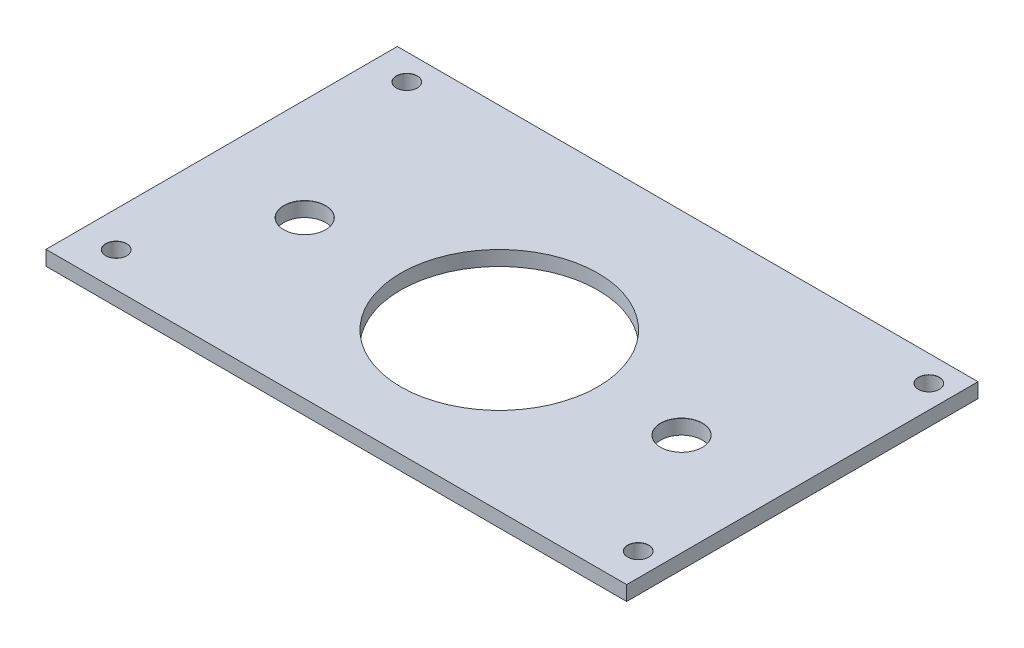
ISO-10303-21;
HEADER;
FILE_DESCRIPTION(('STEP AP214'),'2;1');
FILE_NAME('part.step','',(''),(''),'','','');
FILE_SCHEMA(('AUTOMOTIVE_DESIGN { 1 0 10303 214 1 1 1 1 }'));
ENDSEC;
DATA;
#1=APPLICATION_CONTEXT('core data for automotive mechanical design processes');
#2=APPLICATION_PROTOCOL_DEFINITION('international standard','automotive_design',2000,#1);
#3=PRODUCT_CONTEXT('',#1,'mechanical');
#4=PRODUCT('Part','Part','',(#3));
#5=PRODUCT_RELATED_PRODUCT_CATEGORY('part','',(#4));
#6=PRODUCT_DEFINITION_FORMATION('','',#4);
#7=PRODUCT_DEFINITION_CONTEXT('part definition',#1,'design');
#8=PRODUCT_DEFINITION('design','',#6,#7);
#9=PRODUCT_DEFINITION_SHAPE('','',#8);
#10=(LENGTH_UNIT() NAMED_UNIT(*) SI_UNIT(.MILLI.,.METRE.));
#11=(NAMED_UNIT(*) PLANE_ANGLE_UNIT() SI_UNIT($,.RADIAN.));
#12=(NAMED_UNIT(*) SI_UNIT($,.STERADIAN.) SOLID_ANGLE_UNIT());
#13=UNCERTAINTY_MEASURE_WITH_UNIT(LENGTH_MEASURE(1.E-05),#10,'distance_accuracy_value','');
#14=(GEOMETRIC_REPRESENTATION_CONTEXT(3) GLOBAL_UNCERTAINTY_ASSIGNED_CONTEXT((#13)) GLOBAL_UNIT_ASSIGNED_CONTEXT((#10,
#11,#12)) REPRESENTATION_CONTEXT('',''));
#15=CARTESIAN_POINT('',(0.,0.,0.));
#16=DIRECTION('',(0.,0.,1.));
#17=DIRECTION('',(1.,0.,0.));
#18=AXIS2_PLACEMENT_3D('',#15,#16,#17);
#19=CARTESIAN_POINT('',(0.,3.175,0.));
#20=DIRECTION('',(0.,-1.,0.));
#21=DIRECTION('',(0.,0.,-1.));
#22=AXIS2_PLACEMENT_3D('',#19,#20,#21);
#23=PLANE('',#22);
#24=CARTESIAN_POINT('',(-56.35,3.175,-36.38795554));
#25=DIRECTION('',(0.,1.,0.));
#26=DIRECTION('',(0.,0.,1.));
#27=AXIS2_PLACEMENT_3D('',#24,#25,#26);
#28=CIRCLE('',#27,2.275);
#29=CARTESIAN_POINT('',(-56.35,3.175,-34.11295554));
#30=VERTEX_POINT('',#29);
#31=EDGE_CURVE('E172',#30,#30,#28,.T.);
#32=ORIENTED_EDGE('',*,*,#31,.F.);
#33=EDGE_LOOP('',(#32));
#34=FACE_BOUND('',#33,.T.);
#35=CARTESIAN_POINT('',(-56.35,3.175,26.35));
#36=DIRECTION('',(0.,1.,0.));
#37=DIRECTION('',(0.,0.,1.));
#38=AXIS2_PLACEMENT_3D('',#35,#36,#37);
#39=CIRCLE('',#38,2.275);
#40=CARTESIAN_POINT('',(-56.35,3.175,28.625));
#41=VERTEX_POINT('',#40);
#42=EDGE_CURVE('E163',#41,#41,#39,.T.);
#43=ORIENTED_EDGE('',*,*,#42,.F.);
#44=EDGE_LOOP('',(#43));
#45=FACE_BOUND('',#44,.T.);
#46=CARTESIAN_POINT('',(56.35,3.175,26.35));
#47=DIRECTION('',(0.,1.,0.));
#48=DIRECTION('',(0.,0.,1.));
#49=AXIS2_PLACEMENT_3D('',#46,#47,#48);
#50=CIRCLE('',#49,2.275);
#51=CARTESIAN_POINT('',(56.35,3.175,28.625));
#52=VERTEX_POINT('',#51);
#53=EDGE_CURVE('E154',#52,#52,#50,.T.);
#54=ORIENTED_EDGE('',*,*,#53,.F.);
#55=EDGE_LOOP('',(#54));
#56=FACE_BOUND('',#55,.T.);
#57=CARTESIAN_POINT('',(56.35,3.175,-36.38795554));
#58=DIRECTION('',(0.,1.,0.));
#59=DIRECTION('',(0.,0.,1.));
#60=AXIS2_PLACEMENT_3D('',#57,#58,#59);
#61=CIRCLE('',#60,2.275);
#62=CARTESIAN_POINT('',(56.35,3.175,-34.11295554));
#63=VERTEX_POINT('',#62);
#64=EDGE_CURVE('E145',#63,#63,#61,.T.);
#65=ORIENTED_EDGE('',*,*,#64,.F.);
#66=EDGE_LOOP('',(#65));
#67=FACE_BOUND('',#66,.T.);
#68=CARTESIAN_POINT('',(-42.,3.175,0.));
#69=DIRECTION('',(0.,1.,0.));
#70=DIRECTION('',(0.,0.,1.));
#71=AXIS2_PLACEMENT_3D('',#68,#69,#70);
#72=CIRCLE('',#71,4.525);
#73=CARTESIAN_POINT('',(-42.,3.175,4.525));
#74=VERTEX_POINT('',#73);
#75=EDGE_CURVE('E105',#74,#74,#72,.T.);
#76=ORIENTED_EDGE('',*,*,#75,.F.);
#77=EDGE_LOOP('',(#76));
#78=FACE_BOUND('',#77,.T.);
#79=CARTESIAN_POINT('',(39.35,3.175,0.));
#80=DIRECTION('',(0.,1.,0.));
#81=DIRECTION('',(0.,0.,1.));
#82=AXIS2_PLACEMENT_3D('',#79,#80,#81);
#83=CIRCLE('',#82,4.525);
#84=CARTESIAN_POINT('',(39.35,3.175,4.525));
#85=VERTEX_POINT('',#84);
#86=EDGE_CURVE('E116',#85,#85,#83,.T.);
#87=ORIENTED_EDGE('',*,*,#86,.F.);
#88=EDGE_LOOP('',(#87));
#89=FACE_BOUND('',#88,.T.);
#90=DIRECTION('',(0.,0.,-1.));
#91=VECTOR('',#90,1.);
#92=CARTESIAN_POINT('',(61.35,3.175,0.));
#93=LINE('',#92,#91);
#94=CARTESIAN_POINT('',(61.35,3.175,33.85));
#95=VERTEX_POINT('',#94);
#96=CARTESIAN_POINT('',(61.35,3.175,-42.));
#97=VERTEX_POINT('',#96);
#98=EDGE_CURVE('E11',#95,#97,#93,.T.);
#99=ORIENTED_EDGE('',*,*,#98,.T.);
#100=DIRECTION('',(-1.,0.,0.));
#101=VECTOR('',#100,1.);
#102=CARTESIAN_POINT('',(-64.,3.175,-42.));
#103=LINE('',#102,#101);
#104=CARTESIAN_POINT('',(-64.,3.175,-42.));
#105=VERTEX_POINT('',#104);
#106=EDGE_CURVE('E96',#97,#105,#103,.T.);
#107=ORIENTED_EDGE('',*,*,#106,.T.);
#108=DIRECTION('',(0.,0.,1.));
#109=VECTOR('',#108,1.);
#110=CARTESIAN_POINT('',(-64.,3.175,0.));
#111=LINE('',#110,#109);
#112=CARTESIAN_POINT('',(-64.,3.175,33.85));
#113=VERTEX_POINT('',#112);
#114=EDGE_CURVE('E47',#105,#113,#111,.T.);
#115=ORIENTED_EDGE('',*,*,#114,.T.);
#116=DIRECTION('',(1.,0.,0.));
#117=VECTOR('',#116,1.);
#118=CARTESIAN_POINT('',(-64.,3.175,33.85));
#119=LINE('',#118,#117);
#120=EDGE_CURVE('E93',#113,#95,#119,.T.);
#121=ORIENTED_EDGE('',*,*,#120,.T.);
#122=EDGE_LOOP('',(#99,#107,#115,#121));
#123=FACE_BOUND('',#122,.T.);
#124=CARTESIAN_POINT('',(0.,3.175,0.));
#125=DIRECTION('',(0.,1.,0.));
#126=DIRECTION('',(0.,0.,1.));
#127=AXIS2_PLACEMENT_3D('',#124,#125,#126);
#128=CIRCLE('',#127,21.275);
#129=CARTESIAN_POINT('',(0.,3.175,21.275));
#130=VERTEX_POINT('',#129);
#131=EDGE_CURVE('E85',#130,#130,#128,.T.);
#132=ORIENTED_EDGE('',*,*,#131,.F.);
#133=EDGE_LOOP('',(#132));
#134=FACE_BOUND('',#133,.T.);
#135=ADVANCED_FACE('F37',(#34,#45,#56,#67,#78,#89,#123,#134),#23,.F.);
#136=CARTESIAN_POINT('',(0.,0.,0.));
#137=DIRECTION('',(0.,-1.,0.));
#138=DIRECTION('',(0.,0.,-1.));
#139=AXIS2_PLACEMENT_3D('',#136,#137,#138);
#140=PLANE('',#139);
#141=CARTESIAN_POINT('',(-56.35,0.,-36.38795554));
#142=DIRECTION('',(0.,1.,0.));
#143=DIRECTION('',(0.,0.,1.));
#144=AXIS2_PLACEMENT_3D('',#141,#142,#143);
#145=CIRCLE('',#144,2.25);
#146=CARTESIAN_POINT('',(-56.35,0.,-34.13795554));
#147=VERTEX_POINT('',#146);
#148=EDGE_CURVE('E166',#147,#147,#145,.T.);
#149=ORIENTED_EDGE('',*,*,#148,.T.);
#150=EDGE_LOOP('',(#149));
#151=FACE_BOUND('',#150,.T.);
#152=CARTESIAN_POINT('',(-56.35,0.,26.35));
#153=DIRECTION('',(0.,1.,0.));
#154=DIRECTION('',(0.,0.,1.));
#155=AXIS2_PLACEMENT_3D('',#152,#153,#154);
#156=CIRCLE('',#155,2.25);
#157=CARTESIAN_POINT('',(-56.35,0.,28.6));
#158=VERTEX_POINT('',#157);
#159=EDGE_CURVE('E157',#158,#158,#156,.T.);
#160=ORIENTED_EDGE('',*,*,#159,.T.);
#161=EDGE_LOOP('',(#160));
#162=FACE_BOUND('',#161,.T.);
#163=CARTESIAN_POINT('',(56.35,0.,26.35));
#164=DIRECTION('',(0.,1.,0.));
#165=DIRECTION('',(0.,0.,1.));
#166=AXIS2_PLACEMENT_3D('',#163,#164,#165);
#167=CIRCLE('',#166,2.25);
#168=CARTESIAN_POINT('',(56.35,0.,28.6));
#169=VERTEX_POINT('',#168);
#170=EDGE_CURVE('E148',#169,#169,#167,.T.);
#171=ORIENTED_EDGE('',*,*,#170,.T.);
#172=EDGE_LOOP('',(#171));
#173=FACE_BOUND('',#172,.T.);
#174=CARTESIAN_POINT('',(56.35,0.,-36.38795554));
#175=DIRECTION('',(0.,1.,0.));
#176=DIRECTION('',(0.,0.,1.));
#177=AXIS2_PLACEMENT_3D('',#174,#175,#176);
#178=CIRCLE('',#177,2.25);
#179=CARTESIAN_POINT('',(56.35,0.,-34.13795554));
#180=VERTEX_POINT('',#179);
#181=EDGE_CURVE('E137',#180,#180,#178,.T.);
#182=ORIENTED_EDGE('',*,*,#181,.T.);
#183=EDGE_LOOP('',(#182));
#184=FACE_BOUND('',#183,.T.);
#185=CARTESIAN_POINT('',(-42.,0.,0.));
#186=DIRECTION('',(0.,1.,0.));
#187=DIRECTION('',(0.,0.,1.));
#188=AXIS2_PLACEMENT_3D('',#185,#186,#187);
#189=CIRCLE('',#188,4.49999999999999);
#190=CARTESIAN_POINT('',(-42.,0.,4.49999999999999));
#191=VERTEX_POINT('',#190);
#192=EDGE_CURVE('E113',#191,#191,#189,.T.);
#193=ORIENTED_EDGE('',*,*,#192,.T.);
#194=EDGE_LOOP('',(#193));
#195=FACE_BOUND('',#194,.T.);
#196=CARTESIAN_POINT('',(39.35,0.,0.));
#197=DIRECTION('',(0.,1.,0.));
#198=DIRECTION('',(0.,0.,1.));
#199=AXIS2_PLACEMENT_3D('',#196,#197,#198);
#200=CIRCLE('',#199,4.49999999999999);
#201=CARTESIAN_POINT('',(39.35,0.,4.49999999999999));
#202=VERTEX_POINT('',#201);
#203=EDGE_CURVE('E122',#202,#202,#200,.T.);
#204=ORIENTED_EDGE('',*,*,#203,.T.);
#205=EDGE_LOOP('',(#204));
#206=FACE_BOUND('',#205,.T.);
#207=DIRECTION('',(0.,0.,1.));
#208=VECTOR('',#207,1.);
#209=CARTESIAN_POINT('',(-64.,0.,31.35));
#210=LINE('',#209,#208);
#211=CARTESIAN_POINT('',(-64.,0.,-42.));
#212=VERTEX_POINT('',#211);
#213=CARTESIAN_POINT('',(-64.,0.,33.85));
#214=VERTEX_POINT('',#213);
#215=EDGE_CURVE('E68',#212,#214,#210,.T.);
#216=ORIENTED_EDGE('',*,*,#215,.F.);
#217=DIRECTION('',(-1.,0.,0.));
#218=VECTOR('',#217,1.);
#219=CARTESIAN_POINT('',(-64.,0.,-42.));
#220=LINE('',#219,#218);
#221=CARTESIAN_POINT('',(61.35,0.,-42.));
#222=VERTEX_POINT('',#221);
#223=EDGE_CURVE('E102',#222,#212,#220,.T.);
#224=ORIENTED_EDGE('',*,*,#223,.F.);
#225=DIRECTION('',(0.,0.,-1.));
#226=VECTOR('',#225,1.);
#227=CARTESIAN_POINT('',(61.35,0.,-34.));
#228=LINE('',#227,#226);
#229=CARTESIAN_POINT('',(61.35,0.,33.85));
#230=VERTEX_POINT('',#229);
#231=EDGE_CURVE('E41',#230,#222,#228,.T.);
#232=ORIENTED_EDGE('',*,*,#231,.F.);
#233=DIRECTION('',(1.,0.,0.));
#234=VECTOR('',#233,1.);
#235=CARTESIAN_POINT('',(-64.,0.,33.85));
#236=LINE('',#235,#234);
#237=EDGE_CURVE('E87',#214,#230,#236,.T.);
#238=ORIENTED_EDGE('',*,*,#237,.F.);
#239=EDGE_LOOP('',(#216,#224,#232,#238));
#240=FACE_BOUND('',#239,.T.);
#241=CARTESIAN_POINT('',(0.,0.,0.));
#242=DIRECTION('',(0.,1.,0.));
#243=DIRECTION('',(0.,0.,1.));
#244=AXIS2_PLACEMENT_3D('',#241,#242,#243);
#245=CIRCLE('',#244,21.275);
#246=CARTESIAN_POINT('',(0.,0.,21.275));
#247=VERTEX_POINT('',#246);
#248=EDGE_CURVE('E125',#247,#247,#245,.T.);
#249=ORIENTED_EDGE('',*,*,#248,.T.);
#250=EDGE_LOOP('',(#249));
#251=FACE_BOUND('',#250,.T.);
#252=ADVANCED_FACE('F88',(#151,#162,#173,#184,#195,#206,#240,#251),#140,.T.);
#253=CARTESIAN_POINT('',(-64.,3.175,31.35));
#254=DIRECTION('',(1.,0.,0.));
#255=DIRECTION('',(0.,0.,-1.));
#256=AXIS2_PLACEMENT_3D('',#253,#254,#255);
#257=PLANE('',#256);
#258=ORIENTED_EDGE('',*,*,#215,.T.);
#259=DIRECTION('',(0.,1.,0.));
#260=VECTOR('',#259,1.);
#261=CARTESIAN_POINT('',(-64.,-125.605025775245,33.85));
#262=LINE('',#261,#260);
#263=EDGE_CURVE('E81',#214,#113,#262,.T.);
#264=ORIENTED_EDGE('',*,*,#263,.T.);
#265=ORIENTED_EDGE('',*,*,#114,.F.);
#266=DIRECTION('',(0.,1.,0.));
#267=VECTOR('',#266,1.);
#268=CARTESIAN_POINT('',(-64.,-125.605025775245,-42.));
#269=LINE('',#268,#267);
#270=EDGE_CURVE('E83',#212,#105,#269,.T.);
#271=ORIENTED_EDGE('',*,*,#270,.F.);
#272=EDGE_LOOP('',(#258,#264,#265,#271));
#273=FACE_BOUND('',#272,.T.);
#274=ADVANCED_FACE('F39',(#273),#257,.F.);
#275=CARTESIAN_POINT('',(61.35,3.175,-34.));
#276=DIRECTION('',(-1.,0.,0.));
#277=DIRECTION('',(0.,0.,1.));
#278=AXIS2_PLACEMENT_3D('',#275,#276,#277);
#279=PLANE('',#278);
#280=ORIENTED_EDGE('',*,*,#231,.T.);
#281=DIRECTION('',(0.,1.,0.));
#282=VECTOR('',#281,1.);
#283=CARTESIAN_POINT('',(61.35,-125.605025775245,-42.));
#284=LINE('',#283,#282);
#285=EDGE_CURVE('E98',#222,#97,#284,.T.);
#286=ORIENTED_EDGE('',*,*,#285,.T.);
#287=ORIENTED_EDGE('',*,*,#98,.F.);
#288=DIRECTION('',(0.,1.,0.));
#289=VECTOR('',#288,1.);
#290=CARTESIAN_POINT('',(61.35,-125.605025775245,33.85));
#291=LINE('',#290,#289);
#292=EDGE_CURVE('E92',#230,#95,#291,.T.);
#293=ORIENTED_EDGE('',*,*,#292,.F.);
#294=EDGE_LOOP('',(#280,#286,#287,#293));
#295=FACE_BOUND('',#294,.T.);
#296=ADVANCED_FACE('F131',(#295),#279,.F.);
#297=CARTESIAN_POINT('',(0.,3.175,0.));
#298=DIRECTION('',(0.,-1.,0.));
#299=DIRECTION('',(0.,0.,-1.));
#300=AXIS2_PLACEMENT_3D('',#297,#298,#299);
#301=CYLINDRICAL_SURFACE('',#300,21.275);
#302=ORIENTED_EDGE('',*,*,#131,.T.);
#303=EDGE_LOOP('',(#302));
#304=FACE_BOUND('',#303,.T.);
#305=ORIENTED_EDGE('',*,*,#248,.F.);
#306=EDGE_LOOP('',(#305));
#307=FACE_BOUND('',#306,.T.);
#308=ADVANCED_FACE('F204',(#304,#307),#301,.F.);
#309=CARTESIAN_POINT('',(39.35,3.175,0.));
#310=DIRECTION('',(0.,1.,0.));
#311=DIRECTION('',(0.,0.,1.));
#312=AXIS2_PLACEMENT_3D('',#309,#310,#311);
#313=CYLINDRICAL_SURFACE('',#312,4.49999999999999);
#314=ORIENTED_EDGE('',*,*,#203,.F.);
#315=EDGE_LOOP('',(#314));
#316=FACE_BOUND('',#315,.T.);
#317=CARTESIAN_POINT('',(39.35,3.14999999999999,0.));
#318=DIRECTION('',(0.,1.,0.));
#319=DIRECTION('',(0.,0.,1.));
#320=AXIS2_PLACEMENT_3D('',#317,#318,#319);
#321=CIRCLE('',#320,4.49999999999999);
#322=CARTESIAN_POINT('',(39.35,3.14999999999999,4.49999999999999));
#323=VERTEX_POINT('',#322);
#324=EDGE_CURVE('E119',#323,#323,#321,.T.);
#325=ORIENTED_EDGE('',*,*,#324,.T.);
#326=EDGE_LOOP('',(#325));
#327=FACE_BOUND('',#326,.T.);
#328=ADVANCED_FACE('F194',(#316,#327),#313,.F.);
#329=CARTESIAN_POINT('',(39.35,3.175,0.));
#330=DIRECTION('',(0.,1.,0.));
#331=DIRECTION('',(0.,0.,1.));
#332=AXIS2_PLACEMENT_3D('',#329,#330,#331);
#333=CONICAL_SURFACE('',#332,4.525,0.785398163397414);
#334=ORIENTED_EDGE('',*,*,#324,.F.);
#335=EDGE_LOOP('',(#334));
#336=FACE_BOUND('',#335,.T.);
#337=ORIENTED_EDGE('',*,*,#86,.T.);
#338=EDGE_LOOP('',(#337));
#339=FACE_BOUND('',#338,.T.);
#340=ADVANCED_FACE('F191',(#336,#339),#333,.F.);
#341=CARTESIAN_POINT('',(-42.,3.175,0.));
#342=DIRECTION('',(0.,1.,0.));
#343=DIRECTION('',(0.,0.,1.));
#344=AXIS2_PLACEMENT_3D('',#341,#342,#343);
#345=CYLINDRICAL_SURFACE('',#344,4.49999999999999);
#346=ORIENTED_EDGE('',*,*,#192,.F.);
#347=EDGE_LOOP('',(#346));
#348=FACE_BOUND('',#347,.T.);
#349=CARTESIAN_POINT('',(-42.,3.14999999999999,0.));
#350=DIRECTION('',(0.,1.,0.));
#351=DIRECTION('',(0.,0.,1.));
#352=AXIS2_PLACEMENT_3D('',#349,#350,#351);
#353=CIRCLE('',#352,4.49999999999999);
#354=CARTESIAN_POINT('',(-42.,3.14999999999999,4.49999999999999));
#355=VERTEX_POINT('',#354);
#356=EDGE_CURVE('E110',#355,#355,#353,.T.);
#357=ORIENTED_EDGE('',*,*,#356,.T.);
#358=EDGE_LOOP('',(#357));
#359=FACE_BOUND('',#358,.T.);
#360=ADVANCED_FACE('F193',(#348,#359),#345,.F.);
#361=CARTESIAN_POINT('',(-42.,3.175,0.));
#362=DIRECTION('',(0.,1.,0.));
#363=DIRECTION('',(0.,0.,1.));
#364=AXIS2_PLACEMENT_3D('',#361,#362,#363);
#365=CONICAL_SURFACE('',#364,4.525,0.785398163397414);
#366=ORIENTED_EDGE('',*,*,#356,.F.);
#367=EDGE_LOOP('',(#366));
#368=FACE_BOUND('',#367,.T.);
#369=ORIENTED_EDGE('',*,*,#75,.T.);
#370=EDGE_LOOP('',(#369));
#371=FACE_BOUND('',#370,.T.);
#372=ADVANCED_FACE('F201',(#368,#371),#365,.F.);
#373=CARTESIAN_POINT('',(-64.,-125.605025775245,-42.));
#374=DIRECTION('',(0.,0.,-1.));
#375=DIRECTION('',(-1.,0.,0.));
#376=AXIS2_PLACEMENT_3D('',#373,#374,#375);
#377=PLANE('',#376);
#378=ORIENTED_EDGE('',*,*,#285,.F.);
#379=ORIENTED_EDGE('',*,*,#223,.T.);
#380=ORIENTED_EDGE('',*,*,#270,.T.);
#381=ORIENTED_EDGE('',*,*,#106,.F.);
#382=EDGE_LOOP('',(#378,#379,#380,#381));
#383=FACE_BOUND('',#382,.T.);
#384=ADVANCED_FACE('F135',(#383),#377,.T.);
#385=CARTESIAN_POINT('',(-64.,-125.605025775245,33.85));
#386=DIRECTION('',(0.,0.,1.));
#387=DIRECTION('',(1.,0.,0.));
#388=AXIS2_PLACEMENT_3D('',#385,#386,#387);
#389=PLANE('',#388);
#390=ORIENTED_EDGE('',*,*,#263,.F.);
#391=ORIENTED_EDGE('',*,*,#237,.T.);
#392=ORIENTED_EDGE('',*,*,#292,.T.);
#393=ORIENTED_EDGE('',*,*,#120,.F.);
#394=EDGE_LOOP('',(#390,#391,#392,#393));
#395=FACE_BOUND('',#394,.T.);
#396=ADVANCED_FACE('F95',(#395),#389,.T.);
#397=CARTESIAN_POINT('',(56.35,3.175,-36.38795554));
#398=DIRECTION('',(0.,1.,0.));
#399=DIRECTION('',(0.,0.,1.));
#400=AXIS2_PLACEMENT_3D('',#397,#398,#399);
#401=CYLINDRICAL_SURFACE('',#400,2.25);
#402=ORIENTED_EDGE('',*,*,#181,.F.);
#403=EDGE_LOOP('',(#402));
#404=FACE_BOUND('',#403,.T.);
#405=CARTESIAN_POINT('',(56.35,3.15,-36.38795554));
#406=DIRECTION('',(0.,1.,0.));
#407=DIRECTION('',(0.,0.,1.));
#408=AXIS2_PLACEMENT_3D('',#405,#406,#407);
#409=CIRCLE('',#408,2.25);
#410=CARTESIAN_POINT('',(56.35,3.15,-34.13795554));
#411=VERTEX_POINT('',#410);
#412=EDGE_CURVE('E140',#411,#411,#409,.T.);
#413=ORIENTED_EDGE('',*,*,#412,.T.);
#414=EDGE_LOOP('',(#413));
#415=FACE_BOUND('',#414,.T.);
#416=ADVANCED_FACE('F242',(#404,#415),#401,.F.);
#417=CARTESIAN_POINT('',(56.35,3.175,-36.38795554));
#418=DIRECTION('',(0.,1.,0.));
#419=DIRECTION('',(0.,0.,1.));
#420=AXIS2_PLACEMENT_3D('',#417,#418,#419);
#421=CONICAL_SURFACE('',#420,2.275,0.785398163397414);
#422=ORIENTED_EDGE('',*,*,#412,.F.);
#423=EDGE_LOOP('',(#422));
#424=FACE_BOUND('',#423,.T.);
#425=ORIENTED_EDGE('',*,*,#64,.T.);
#426=EDGE_LOOP('',(#425));
#427=FACE_BOUND('',#426,.T.);
#428=ADVANCED_FACE('F323',(#424,#427),#421,.F.);
#429=CARTESIAN_POINT('',(56.35,3.175,26.35));
#430=DIRECTION('',(0.,1.,0.));
#431=DIRECTION('',(0.,0.,1.));
#432=AXIS2_PLACEMENT_3D('',#429,#430,#431);
#433=CYLINDRICAL_SURFACE('',#432,2.25);
#434=ORIENTED_EDGE('',*,*,#170,.F.);
#435=EDGE_LOOP('',(#434));
#436=FACE_BOUND('',#435,.T.);
#437=CARTESIAN_POINT('',(56.35,3.15,26.35));
#438=DIRECTION('',(0.,1.,0.));
#439=DIRECTION('',(0.,0.,1.));
#440=AXIS2_PLACEMENT_3D('',#437,#438,#439);
#441=CIRCLE('',#440,2.25);
#442=CARTESIAN_POINT('',(56.35,3.15,28.6));
#443=VERTEX_POINT('',#442);
#444=EDGE_CURVE('E151',#443,#443,#441,.T.);
#445=ORIENTED_EDGE('',*,*,#444,.T.);
#446=EDGE_LOOP('',(#445));
#447=FACE_BOUND('',#446,.T.);
#448=ADVANCED_FACE('F327',(#436,#447),#433,.F.);
#449=CARTESIAN_POINT('',(56.35,3.175,26.35));
#450=DIRECTION('',(0.,1.,0.));
#451=DIRECTION('',(0.,0.,1.));
#452=AXIS2_PLACEMENT_3D('',#449,#450,#451);
#453=CONICAL_SURFACE('',#452,2.275,0.785398163397414);
#454=ORIENTED_EDGE('',*,*,#444,.F.);
#455=EDGE_LOOP('',(#454));
#456=FACE_BOUND('',#455,.T.);
#457=ORIENTED_EDGE('',*,*,#53,.T.);
#458=EDGE_LOOP('',(#457));
#459=FACE_BOUND('',#458,.T.);
#460=ADVANCED_FACE('F331',(#456,#459),#453,.F.);
#461=CARTESIAN_POINT('',(-56.35,3.175,26.35));
#462=DIRECTION('',(0.,1.,0.));
#463=DIRECTION('',(0.,0.,1.));
#464=AXIS2_PLACEMENT_3D('',#461,#462,#463);
#465=CYLINDRICAL_SURFACE('',#464,2.25);
#466=ORIENTED_EDGE('',*,*,#159,.F.);
#467=EDGE_LOOP('',(#466));
#468=FACE_BOUND('',#467,.T.);
#469=CARTESIAN_POINT('',(-56.35,3.15,26.35));
#470=DIRECTION('',(0.,1.,0.));
#471=DIRECTION('',(0.,0.,1.));
#472=AXIS2_PLACEMENT_3D('',#469,#470,#471);
#473=CIRCLE('',#472,2.25);
#474=CARTESIAN_POINT('',(-56.35,3.15,28.6));
#475=VERTEX_POINT('',#474);
#476=EDGE_CURVE('E160',#475,#475,#473,.T.);
#477=ORIENTED_EDGE('',*,*,#476,.T.);
#478=EDGE_LOOP('',(#477));
#479=FACE_BOUND('',#478,.T.);
#480=ADVANCED_FACE('F335',(#468,#479),#465,.F.);
#481=CARTESIAN_POINT('',(-56.35,3.175,26.35));
#482=DIRECTION('',(0.,1.,0.));
#483=DIRECTION('',(0.,0.,1.));
#484=AXIS2_PLACEMENT_3D('',#481,#482,#483);
#485=CONICAL_SURFACE('',#484,2.275,0.785398163397414);
#486=ORIENTED_EDGE('',*,*,#476,.F.);
#487=EDGE_LOOP('',(#486));
#488=FACE_BOUND('',#487,.T.);
#489=ORIENTED_EDGE('',*,*,#42,.T.);
#490=EDGE_LOOP('',(#489));
#491=FACE_BOUND('',#490,.T.);
#492=ADVANCED_FACE('F339',(#488,#491),#485,.F.);
#493=CARTESIAN_POINT('',(-56.35,3.175,-36.38795554));
#494=DIRECTION('',(0.,1.,0.));
#495=DIRECTION('',(0.,0.,1.));
#496=AXIS2_PLACEMENT_3D('',#493,#494,#495);
#497=CYLINDRICAL_SURFACE('',#496,2.25);
#498=ORIENTED_EDGE('',*,*,#148,.F.);
#499=EDGE_LOOP('',(#498));
#500=FACE_BOUND('',#499,.T.);
#501=CARTESIAN_POINT('',(-56.35,3.15,-36.38795554));
#502=DIRECTION('',(0.,1.,0.));
#503=DIRECTION('',(0.,0.,1.));
#504=AXIS2_PLACEMENT_3D('',#501,#502,#503);
#505=CIRCLE('',#504,2.25);
#506=CARTESIAN_POINT('',(-56.35,3.15,-34.13795554));
#507=VERTEX_POINT('',#506);
#508=EDGE_CURVE('E169',#507,#507,#505,.T.);
#509=ORIENTED_EDGE('',*,*,#508,.T.);
#510=EDGE_LOOP('',(#509));
#511=FACE_BOUND('',#510,.T.);
#512=ADVANCED_FACE('F343',(#500,#511),#497,.F.);
#513=CARTESIAN_POINT('',(-56.35,3.175,-36.38795554));
#514=DIRECTION('',(0.,1.,0.));
#515=DIRECTION('',(0.,0.,1.));
#516=AXIS2_PLACEMENT_3D('',#513,#514,#515);
#517=CONICAL_SURFACE('',#516,2.275,0.785398163397414);
#518=ORIENTED_EDGE('',*,*,#508,.F.);
#519=EDGE_LOOP('',(#518));
#520=FACE_BOUND('',#519,.T.);
#521=ORIENTED_EDGE('',*,*,#31,.T.);
#522=EDGE_LOOP('',(#521));
#523=FACE_BOUND('',#522,.T.);
#524=ADVANCED_FACE('F176',(#520,#523),#517,.F.);
#525=CLOSED_SHELL('',(#135,#252,#274,#296,#308,#328,#340,#360,#372,#384,#396,#416,#428,#448,
#460,#480,#492,#512,#524));
#526=MANIFOLD_SOLID_BREP('B2',#525);
#527=ADVANCED_BREP_SHAPE_REPRESENTATION('',(#18,#526),#14);
#528=SHAPE_DEFINITION_REPRESENTATION(#9,#527);
ENDSEC;
END-ISO-10303-21;
